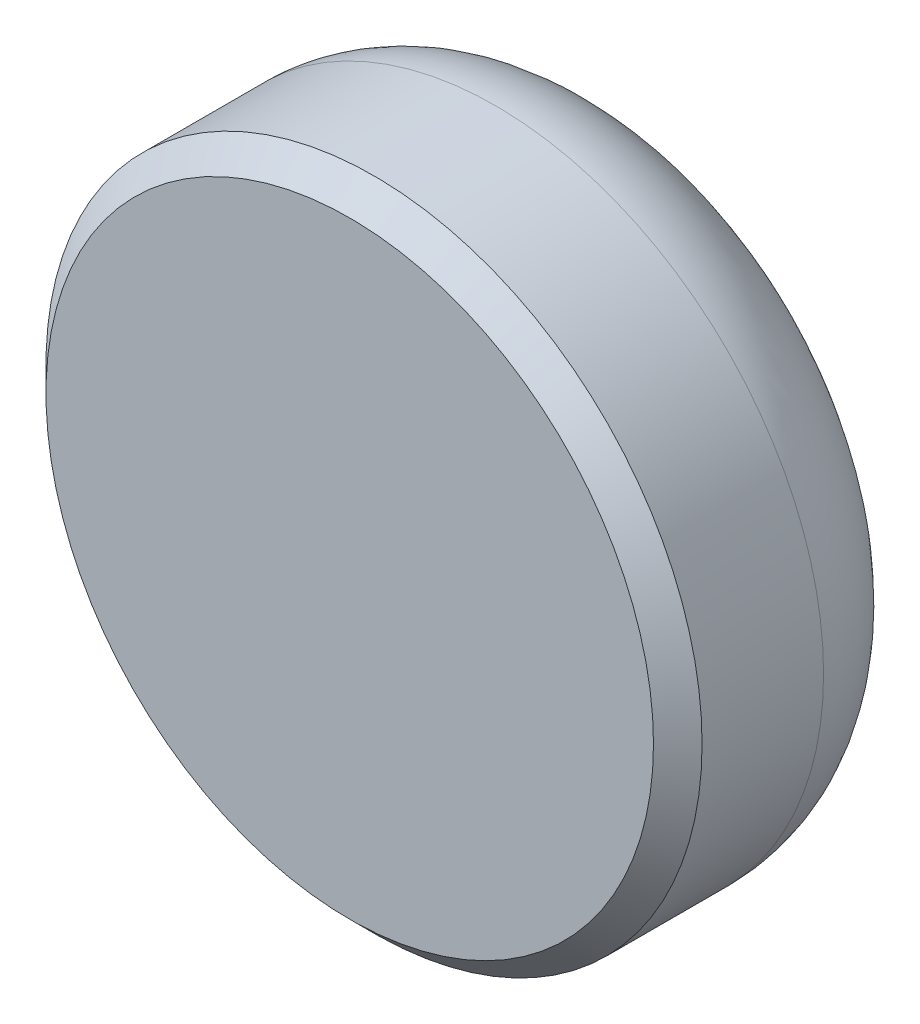
ISO-10303-21;
HEADER;
FILE_DESCRIPTION(('STEP AP214'),'2;1');
FILE_NAME('part.step','',(''),(''),'','','');
FILE_SCHEMA(('AUTOMOTIVE_DESIGN { 1 0 10303 214 1 1 1 1 }'));
ENDSEC;
DATA;
#1=APPLICATION_CONTEXT('core data for automotive mechanical design processes');
#2=APPLICATION_PROTOCOL_DEFINITION('international standard','automotive_design',2000,#1);
#3=PRODUCT_CONTEXT('',#1,'mechanical');
#4=PRODUCT('Part','Part','',(#3));
#5=PRODUCT_RELATED_PRODUCT_CATEGORY('part','',(#4));
#6=PRODUCT_DEFINITION_FORMATION('','',#4);
#7=PRODUCT_DEFINITION_CONTEXT('part definition',#1,'design');
#8=PRODUCT_DEFINITION('design','',#6,#7);
#9=PRODUCT_DEFINITION_SHAPE('','',#8);
#10=(LENGTH_UNIT() NAMED_UNIT(*) SI_UNIT(.MILLI.,.METRE.));
#11=(NAMED_UNIT(*) PLANE_ANGLE_UNIT() SI_UNIT($,.RADIAN.));
#12=(NAMED_UNIT(*) SI_UNIT($,.STERADIAN.) SOLID_ANGLE_UNIT());
#13=UNCERTAINTY_MEASURE_WITH_UNIT(LENGTH_MEASURE(1.E-05),#10,'distance_accuracy_value','');
#14=(GEOMETRIC_REPRESENTATION_CONTEXT(3) GLOBAL_UNCERTAINTY_ASSIGNED_CONTEXT((#13)) GLOBAL_UNIT_ASSIGNED_CONTEXT((#10,
#11,#12)) REPRESENTATION_CONTEXT('',''));
#15=CARTESIAN_POINT('',(0.,0.,0.));
#16=DIRECTION('',(0.,0.,1.));
#17=DIRECTION('',(1.,0.,0.));
#18=AXIS2_PLACEMENT_3D('',#15,#16,#17);
#19=CARTESIAN_POINT('',(0.,0.,2.2));
#20=DIRECTION('',(0.,0.,-1.));
#21=DIRECTION('',(-1.,0.,0.));
#22=AXIS2_PLACEMENT_3D('',#19,#20,#21);
#23=CYLINDRICAL_SURFACE('',#22,2.7);
#24=CARTESIAN_POINT('',(0.,0.,2.));
#25=DIRECTION('',(0.,0.,1.));
#26=DIRECTION('',(1.,0.,0.));
#27=AXIS2_PLACEMENT_3D('',#24,#25,#26);
#28=CIRCLE('',#27,2.7);
#29=CARTESIAN_POINT('',(2.7,0.,2.));
#30=VERTEX_POINT('',#29);
#31=EDGE_CURVE('E10',#30,#30,#28,.F.);
#32=ORIENTED_EDGE('',*,*,#31,.T.);
#33=EDGE_LOOP('',(#32));
#34=FACE_BOUND('',#33,.T.);
#35=CARTESIAN_POINT('',(0.,0.,1.));
#36=DIRECTION('',(0.,0.,1.));
#37=DIRECTION('',(1.,0.,0.));
#38=AXIS2_PLACEMENT_3D('',#35,#36,#37);
#39=CIRCLE('',#38,2.7);
#40=CARTESIAN_POINT('',(2.7,0.,1.));
#41=VERTEX_POINT('',#40);
#42=EDGE_CURVE('E47',#41,#41,#39,.T.);
#43=ORIENTED_EDGE('',*,*,#42,.T.);
#44=EDGE_LOOP('',(#43));
#45=FACE_BOUND('',#44,.T.);
#46=ADVANCED_FACE('F32',(#34,#45),#23,.T.);
#47=CARTESIAN_POINT('',(0.,0.,2.2));
#48=DIRECTION('',(0.,0.,1.));
#49=DIRECTION('',(1.,0.,0.));
#50=AXIS2_PLACEMENT_3D('',#47,#48,#49);
#51=PLANE('',#50);
#52=CARTESIAN_POINT('',(0.,0.,2.2));
#53=DIRECTION('',(0.,0.,1.));
#54=DIRECTION('',(1.,0.,0.));
#55=AXIS2_PLACEMENT_3D('',#52,#53,#54);
#56=CIRCLE('',#55,2.5);
#57=CARTESIAN_POINT('',(2.5,0.,2.2));
#58=VERTEX_POINT('',#57);
#59=EDGE_CURVE('E39',#58,#58,#56,.T.);
#60=ORIENTED_EDGE('',*,*,#59,.T.);
#61=EDGE_LOOP('',(#60));
#62=FACE_BOUND('',#61,.T.);
#63=ADVANCED_FACE('F63',(#62),#51,.T.);
#64=CARTESIAN_POINT('',(0.,0.,0.));
#65=DIRECTION('',(0.,0.,1.));
#66=DIRECTION('',(1.,0.,0.));
#67=AXIS2_PLACEMENT_3D('',#64,#65,#66);
#68=PLANE('',#67);
#69=CARTESIAN_POINT('',(0.,0.,0.));
#70=DIRECTION('',(0.,0.,1.));
#71=DIRECTION('',(1.,0.,0.));
#72=AXIS2_PLACEMENT_3D('',#69,#70,#71);
#73=CIRCLE('',#72,1.7);
#74=CARTESIAN_POINT('',(1.7,0.,0.));
#75=VERTEX_POINT('',#74);
#76=EDGE_CURVE('E43',#75,#75,#73,.F.);
#77=ORIENTED_EDGE('',*,*,#76,.T.);
#78=EDGE_LOOP('',(#77));
#79=FACE_BOUND('',#78,.T.);
#80=ADVANCED_FACE('F56',(#79),#68,.F.);
#81=CARTESIAN_POINT('',(0.,0.,1.));
#82=DIRECTION('',(0.,0.,1.));
#83=DIRECTION('',(1.,0.,0.));
#84=AXIS2_PLACEMENT_3D('',#81,#82,#83);
#85=TOROIDAL_SURFACE('',#84,1.7,1.);
#86=ORIENTED_EDGE('',*,*,#76,.F.);
#87=EDGE_LOOP('',(#86));
#88=FACE_BOUND('',#87,.T.);
#89=ORIENTED_EDGE('',*,*,#42,.F.);
#90=EDGE_LOOP('',(#89));
#91=FACE_BOUND('',#90,.T.);
#92=ADVANCED_FACE('F54',(#88,#91),#85,.T.);
#93=CARTESIAN_POINT('',(0.,0.,2.2));
#94=DIRECTION('',(0.,0.,-1.));
#95=DIRECTION('',(-1.,0.,0.));
#96=AXIS2_PLACEMENT_3D('',#93,#94,#95);
#97=CONICAL_SURFACE('',#96,2.5,0.785398163397444);
#98=ORIENTED_EDGE('',*,*,#31,.F.);
#99=EDGE_LOOP('',(#98));
#100=FACE_BOUND('',#99,.T.);
#101=ORIENTED_EDGE('',*,*,#59,.F.);
#102=EDGE_LOOP('',(#101));
#103=FACE_BOUND('',#102,.T.);
#104=ADVANCED_FACE('F34',(#100,#103),#97,.T.);
#105=CLOSED_SHELL('',(#46,#63,#80,#92,#104));
#106=MANIFOLD_SOLID_BREP('B2',#105);
#107=ADVANCED_BREP_SHAPE_REPRESENTATION('',(#18,#106),#14);
#108=SHAPE_DEFINITION_REPRESENTATION(#9,#107);
ENDSEC;
END-ISO-10303-21;
